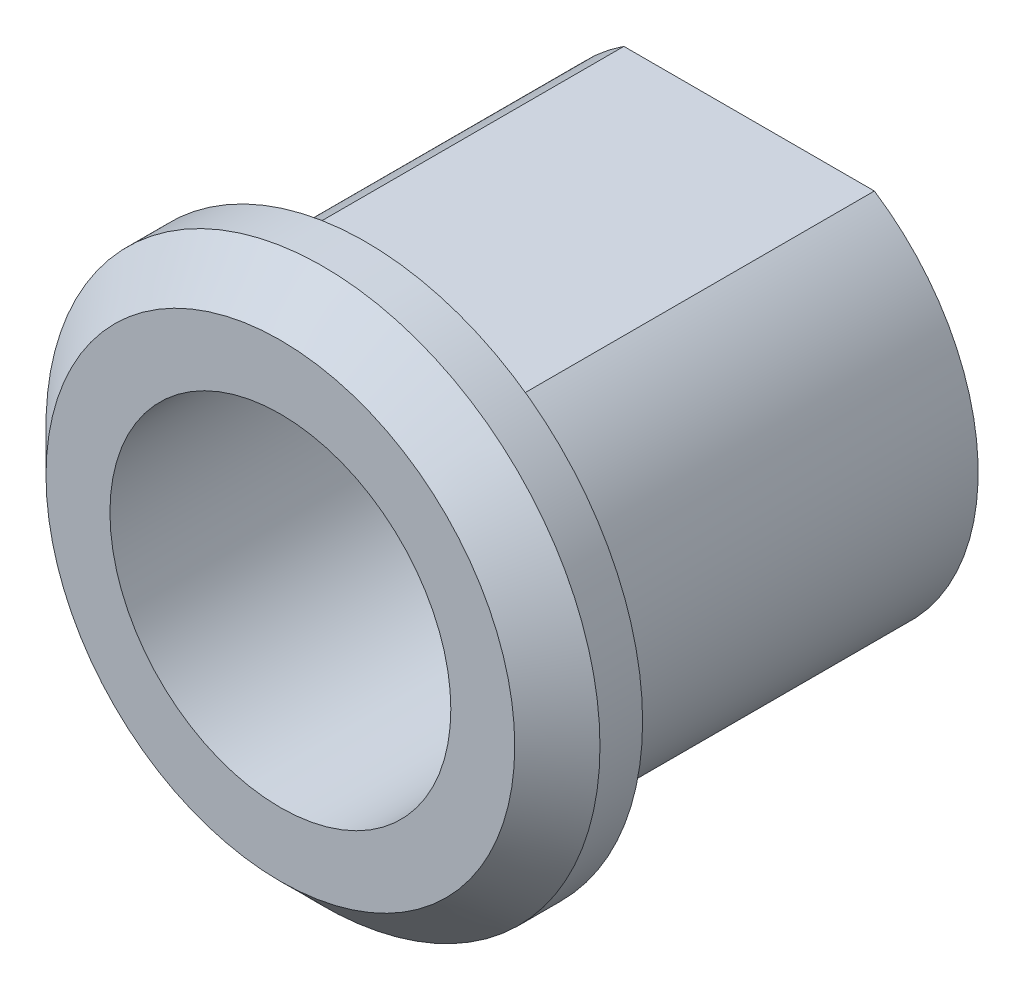
ISO-10303-21;
HEADER;
FILE_DESCRIPTION(('STEP AP214'),'2;1');
FILE_NAME('part.step','',(''),(''),'','','');
FILE_SCHEMA(('AUTOMOTIVE_DESIGN { 1 0 10303 214 1 1 1 1 }'));
ENDSEC;
DATA;
#1=APPLICATION_CONTEXT('core data for automotive mechanical design processes');
#2=APPLICATION_PROTOCOL_DEFINITION('international standard','automotive_design',2000,#1);
#3=PRODUCT_CONTEXT('',#1,'mechanical');
#4=PRODUCT('Part','Part','',(#3));
#5=PRODUCT_RELATED_PRODUCT_CATEGORY('part','',(#4));
#6=PRODUCT_DEFINITION_FORMATION('','',#4);
#7=PRODUCT_DEFINITION_CONTEXT('part definition',#1,'design');
#8=PRODUCT_DEFINITION('design','',#6,#7);
#9=PRODUCT_DEFINITION_SHAPE('','',#8);
#10=(LENGTH_UNIT() NAMED_UNIT(*) SI_UNIT(.MILLI.,.METRE.));
#11=(NAMED_UNIT(*) PLANE_ANGLE_UNIT() SI_UNIT($,.RADIAN.));
#12=(NAMED_UNIT(*) SI_UNIT($,.STERADIAN.) SOLID_ANGLE_UNIT());
#13=UNCERTAINTY_MEASURE_WITH_UNIT(LENGTH_MEASURE(1.E-05),#10,'distance_accuracy_value','');
#14=(GEOMETRIC_REPRESENTATION_CONTEXT(3) GLOBAL_UNCERTAINTY_ASSIGNED_CONTEXT((#13)) GLOBAL_UNIT_ASSIGNED_CONTEXT((#10,
#11,#12)) REPRESENTATION_CONTEXT('',''));
#15=CARTESIAN_POINT('',(0.,0.,0.));
#16=DIRECTION('',(0.,0.,1.));
#17=DIRECTION('',(1.,0.,0.));
#18=AXIS2_PLACEMENT_3D('',#15,#16,#17);
#19=CARTESIAN_POINT('',(0.,0.,0.));
#20=DIRECTION('',(0.,0.,1.));
#21=DIRECTION('',(1.,0.,0.));
#22=AXIS2_PLACEMENT_3D('',#19,#20,#21);
#23=PLANE('',#22);
#24=CARTESIAN_POINT('',(0.,0.,0.));
#25=DIRECTION('',(0.,0.,1.));
#26=DIRECTION('',(1.,0.,0.));
#27=AXIS2_PLACEMENT_3D('',#24,#25,#26);
#28=CIRCLE('',#27,13.);
#29=CARTESIAN_POINT('',(13.,0.,0.));
#30=VERTEX_POINT('',#29);
#31=EDGE_CURVE('E101',#30,#30,#28,.T.);
#32=ORIENTED_EDGE('',*,*,#31,.F.);
#33=EDGE_LOOP('',(#32));
#34=FACE_BOUND('',#33,.T.);
#35=CARTESIAN_POINT('',(0.,0.,0.));
#36=DIRECTION('',(0.,0.,-1.));
#37=DIRECTION('',(-1.,0.,0.));
#38=AXIS2_PLACEMENT_3D('',#35,#36,#37);
#39=CIRCLE('',#38,10.75);
#40=CARTESIAN_POINT('',(5.87898800815242,9.,0.));
#41=VERTEX_POINT('',#40);
#42=CARTESIAN_POINT('',(5.87898800815242,-9.,0.));
#43=VERTEX_POINT('',#42);
#44=EDGE_CURVE('E97',#41,#43,#39,.T.);
#45=ORIENTED_EDGE('',*,*,#44,.F.);
#46=DIRECTION('',(1.,0.,0.));
#47=VECTOR('',#46,1.);
#48=CARTESIAN_POINT('',(5.87898800815242,9.,0.));
#49=LINE('',#48,#47);
#50=CARTESIAN_POINT('',(-5.87898800815242,9.,0.));
#51=VERTEX_POINT('',#50);
#52=EDGE_CURVE('E94',#51,#41,#49,.T.);
#53=ORIENTED_EDGE('',*,*,#52,.F.);
#54=CARTESIAN_POINT('',(0.,0.,0.));
#55=DIRECTION('',(0.,0.,-1.));
#56=DIRECTION('',(-1.,0.,0.));
#57=AXIS2_PLACEMENT_3D('',#54,#55,#56);
#58=CIRCLE('',#57,10.75);
#59=CARTESIAN_POINT('',(-5.87898800815242,-9.,0.));
#60=VERTEX_POINT('',#59);
#61=EDGE_CURVE('E56',#60,#51,#58,.T.);
#62=ORIENTED_EDGE('',*,*,#61,.F.);
#63=DIRECTION('',(-1.,0.,0.));
#64=VECTOR('',#63,1.);
#65=CARTESIAN_POINT('',(5.87898800815242,-9.,0.));
#66=LINE('',#65,#64);
#67=EDGE_CURVE('E51',#43,#60,#66,.T.);
#68=ORIENTED_EDGE('',*,*,#67,.F.);
#69=EDGE_LOOP('',(#45,#53,#62,#68));
#70=FACE_BOUND('',#69,.T.);
#71=ADVANCED_FACE('F36',(#34,#70),#23,.F.);
#72=CARTESIAN_POINT('',(0.,0.,4.));
#73=DIRECTION('',(0.,0.,1.));
#74=DIRECTION('',(1.,0.,0.));
#75=AXIS2_PLACEMENT_3D('',#72,#73,#74);
#76=PLANE('',#75);
#77=CARTESIAN_POINT('',(0.,0.,4.));
#78=DIRECTION('',(0.,0.,1.));
#79=DIRECTION('',(1.,0.,0.));
#80=AXIS2_PLACEMENT_3D('',#77,#78,#79);
#81=CIRCLE('',#80,11.);
#82=CARTESIAN_POINT('',(11.,0.,4.));
#83=VERTEX_POINT('',#82);
#84=EDGE_CURVE('E44',#83,#83,#81,.T.);
#85=ORIENTED_EDGE('',*,*,#84,.T.);
#86=EDGE_LOOP('',(#85));
#87=FACE_BOUND('',#86,.T.);
#88=CARTESIAN_POINT('',(0.,0.,4.));
#89=DIRECTION('',(0.,0.,1.));
#90=DIRECTION('',(1.,0.,0.));
#91=AXIS2_PLACEMENT_3D('',#88,#89,#90);
#92=CIRCLE('',#91,8.);
#93=CARTESIAN_POINT('',(8.,0.,4.));
#94=VERTEX_POINT('',#93);
#95=EDGE_CURVE('E98',#94,#94,#92,.T.);
#96=ORIENTED_EDGE('',*,*,#95,.F.);
#97=EDGE_LOOP('',(#96));
#98=FACE_BOUND('',#97,.T.);
#99=ADVANCED_FACE('F111',(#87,#98),#76,.T.);
#100=CARTESIAN_POINT('',(0.,0.,4.));
#101=DIRECTION('',(0.,0.,-1.));
#102=DIRECTION('',(-1.,0.,0.));
#103=AXIS2_PLACEMENT_3D('',#100,#101,#102);
#104=CYLINDRICAL_SURFACE('',#103,13.);
#105=CARTESIAN_POINT('',(0.,0.,2.));
#106=DIRECTION('',(0.,0.,1.));
#107=DIRECTION('',(1.,0.,0.));
#108=AXIS2_PLACEMENT_3D('',#105,#106,#107);
#109=CIRCLE('',#108,13.);
#110=CARTESIAN_POINT('',(13.,0.,2.));
#111=VERTEX_POINT('',#110);
#112=EDGE_CURVE('E11',#111,#111,#109,.F.);
#113=ORIENTED_EDGE('',*,*,#112,.T.);
#114=EDGE_LOOP('',(#113));
#115=FACE_BOUND('',#114,.T.);
#116=ORIENTED_EDGE('',*,*,#31,.T.);
#117=EDGE_LOOP('',(#116));
#118=FACE_BOUND('',#117,.T.);
#119=ADVANCED_FACE('F129',(#115,#118),#104,.T.);
#120=CARTESIAN_POINT('',(0.,0.,4.));
#121=DIRECTION('',(0.,0.,-1.));
#122=DIRECTION('',(-1.,0.,0.));
#123=AXIS2_PLACEMENT_3D('',#120,#121,#122);
#124=CYLINDRICAL_SURFACE('',#123,8.);
#125=ORIENTED_EDGE('',*,*,#95,.T.);
#126=EDGE_LOOP('',(#125));
#127=FACE_BOUND('',#126,.T.);
#128=CARTESIAN_POINT('',(0.,0.,-18.));
#129=DIRECTION('',(0.,0.,1.));
#130=DIRECTION('',(1.,0.,0.));
#131=AXIS2_PLACEMENT_3D('',#128,#129,#130);
#132=CIRCLE('',#131,8.);
#133=CARTESIAN_POINT('',(8.,0.,-18.));
#134=VERTEX_POINT('',#133);
#135=EDGE_CURVE('E167',#134,#134,#132,.T.);
#136=ORIENTED_EDGE('',*,*,#135,.F.);
#137=EDGE_LOOP('',(#136));
#138=FACE_BOUND('',#137,.T.);
#139=ADVANCED_FACE('F134',(#127,#138),#124,.F.);
#140=CARTESIAN_POINT('',(0.,0.,-18.));
#141=DIRECTION('',(0.,0.,1.));
#142=DIRECTION('',(1.,0.,0.));
#143=AXIS2_PLACEMENT_3D('',#140,#141,#142);
#144=CYLINDRICAL_SURFACE('',#143,10.75);
#145=ORIENTED_EDGE('',*,*,#44,.T.);
#146=DIRECTION('',(0.,0.,1.));
#147=VECTOR('',#146,1.);
#148=CARTESIAN_POINT('',(5.87898800815242,-9.,-18.));
#149=LINE('',#148,#147);
#150=CARTESIAN_POINT('',(5.87898800815242,-9.,-18.));
#151=VERTEX_POINT('',#150);
#152=EDGE_CURVE('E78',#151,#43,#149,.T.);
#153=ORIENTED_EDGE('',*,*,#152,.F.);
#154=CARTESIAN_POINT('',(0.,0.,-18.));
#155=DIRECTION('',(0.,0.,-1.));
#156=DIRECTION('',(-1.,0.,0.));
#157=AXIS2_PLACEMENT_3D('',#154,#155,#156);
#158=CIRCLE('',#157,10.75);
#159=CARTESIAN_POINT('',(5.87898800815242,9.,-18.));
#160=VERTEX_POINT('',#159);
#161=EDGE_CURVE('E85',#160,#151,#158,.T.);
#162=ORIENTED_EDGE('',*,*,#161,.F.);
#163=DIRECTION('',(0.,0.,1.));
#164=VECTOR('',#163,1.);
#165=CARTESIAN_POINT('',(5.87898800815242,9.,-18.));
#166=LINE('',#165,#164);
#167=EDGE_CURVE('E159',#160,#41,#166,.T.);
#168=ORIENTED_EDGE('',*,*,#167,.T.);
#169=EDGE_LOOP('',(#145,#153,#162,#168));
#170=FACE_BOUND('',#169,.T.);
#171=ADVANCED_FACE('F96',(#170),#144,.T.);
#172=CARTESIAN_POINT('',(5.87898800815242,-9.,-18.));
#173=DIRECTION('',(0.,1.,0.));
#174=DIRECTION('',(0.,0.,1.));
#175=AXIS2_PLACEMENT_3D('',#172,#173,#174);
#176=PLANE('',#175);
#177=ORIENTED_EDGE('',*,*,#67,.T.);
#178=DIRECTION('',(0.,0.,1.));
#179=VECTOR('',#178,1.);
#180=CARTESIAN_POINT('',(-5.87898800815242,-9.,-18.));
#181=LINE('',#180,#179);
#182=CARTESIAN_POINT('',(-5.87898800815242,-9.,-18.));
#183=VERTEX_POINT('',#182);
#184=EDGE_CURVE('E81',#183,#60,#181,.T.);
#185=ORIENTED_EDGE('',*,*,#184,.F.);
#186=DIRECTION('',(-1.,0.,0.));
#187=VECTOR('',#186,1.);
#188=CARTESIAN_POINT('',(5.87898800815242,-9.,-18.));
#189=LINE('',#188,#187);
#190=EDGE_CURVE('E74',#151,#183,#189,.T.);
#191=ORIENTED_EDGE('',*,*,#190,.F.);
#192=ORIENTED_EDGE('',*,*,#152,.T.);
#193=EDGE_LOOP('',(#177,#185,#191,#192));
#194=FACE_BOUND('',#193,.T.);
#195=ADVANCED_FACE('F76',(#194),#176,.F.);
#196=CARTESIAN_POINT('',(0.,0.,-18.));
#197=DIRECTION('',(0.,0.,1.));
#198=DIRECTION('',(1.,0.,0.));
#199=AXIS2_PLACEMENT_3D('',#196,#197,#198);
#200=CYLINDRICAL_SURFACE('',#199,10.75);
#201=ORIENTED_EDGE('',*,*,#61,.T.);
#202=DIRECTION('',(0.,0.,1.));
#203=VECTOR('',#202,1.);
#204=CARTESIAN_POINT('',(-5.87898800815242,9.,-18.));
#205=LINE('',#204,#203);
#206=CARTESIAN_POINT('',(-5.87898800815242,9.,-18.));
#207=VERTEX_POINT('',#206);
#208=EDGE_CURVE('E103',#207,#51,#205,.T.);
#209=ORIENTED_EDGE('',*,*,#208,.F.);
#210=CARTESIAN_POINT('',(0.,0.,-18.));
#211=DIRECTION('',(0.,0.,-1.));
#212=DIRECTION('',(-1.,0.,0.));
#213=AXIS2_PLACEMENT_3D('',#210,#211,#212);
#214=CIRCLE('',#213,10.75);
#215=EDGE_CURVE('E84',#183,#207,#214,.T.);
#216=ORIENTED_EDGE('',*,*,#215,.F.);
#217=ORIENTED_EDGE('',*,*,#184,.T.);
#218=EDGE_LOOP('',(#201,#209,#216,#217));
#219=FACE_BOUND('',#218,.T.);
#220=ADVANCED_FACE('F149',(#219),#200,.T.);
#221=CARTESIAN_POINT('',(5.87898800815242,9.,-18.));
#222=DIRECTION('',(0.,-1.,0.));
#223=DIRECTION('',(0.,0.,-1.));
#224=AXIS2_PLACEMENT_3D('',#221,#222,#223);
#225=PLANE('',#224);
#226=ORIENTED_EDGE('',*,*,#52,.T.);
#227=ORIENTED_EDGE('',*,*,#167,.F.);
#228=DIRECTION('',(1.,0.,0.));
#229=VECTOR('',#228,1.);
#230=CARTESIAN_POINT('',(5.87898800815242,9.,-18.));
#231=LINE('',#230,#229);
#232=EDGE_CURVE('E90',#207,#160,#231,.T.);
#233=ORIENTED_EDGE('',*,*,#232,.F.);
#234=ORIENTED_EDGE('',*,*,#208,.T.);
#235=EDGE_LOOP('',(#226,#227,#233,#234));
#236=FACE_BOUND('',#235,.T.);
#237=ADVANCED_FACE('F119',(#236),#225,.F.);
#238=CARTESIAN_POINT('',(0.,0.,-18.));
#239=DIRECTION('',(0.,0.,-1.));
#240=DIRECTION('',(-1.,0.,0.));
#241=AXIS2_PLACEMENT_3D('',#238,#239,#240);
#242=PLANE('',#241);
#243=ORIENTED_EDGE('',*,*,#135,.T.);
#244=EDGE_LOOP('',(#243));
#245=FACE_BOUND('',#244,.T.);
#246=ORIENTED_EDGE('',*,*,#161,.T.);
#247=ORIENTED_EDGE('',*,*,#190,.T.);
#248=ORIENTED_EDGE('',*,*,#215,.T.);
#249=ORIENTED_EDGE('',*,*,#232,.T.);
#250=EDGE_LOOP('',(#246,#247,#248,#249));
#251=FACE_BOUND('',#250,.T.);
#252=ADVANCED_FACE('F88',(#245,#251),#242,.T.);
#253=CARTESIAN_POINT('',(0.,0.,4.));
#254=DIRECTION('',(0.,0.,-1.));
#255=DIRECTION('',(-1.,0.,0.));
#256=AXIS2_PLACEMENT_3D('',#253,#254,#255);
#257=CONICAL_SURFACE('',#256,11.,0.785398163397448);
#258=ORIENTED_EDGE('',*,*,#112,.F.);
#259=EDGE_LOOP('',(#258));
#260=FACE_BOUND('',#259,.T.);
#261=ORIENTED_EDGE('',*,*,#84,.F.);
#262=EDGE_LOOP('',(#261));
#263=FACE_BOUND('',#262,.T.);
#264=ADVANCED_FACE('F38',(#260,#263),#257,.T.);
#265=CLOSED_SHELL('',(#71,#99,#119,#139,#171,#195,#220,#237,#252,#264));
#266=MANIFOLD_SOLID_BREP('B2',#265);
#267=ADVANCED_BREP_SHAPE_REPRESENTATION('',(#18,#266),#14);
#268=SHAPE_DEFINITION_REPRESENTATION(#9,#267);
ENDSEC;
END-ISO-10303-21;
